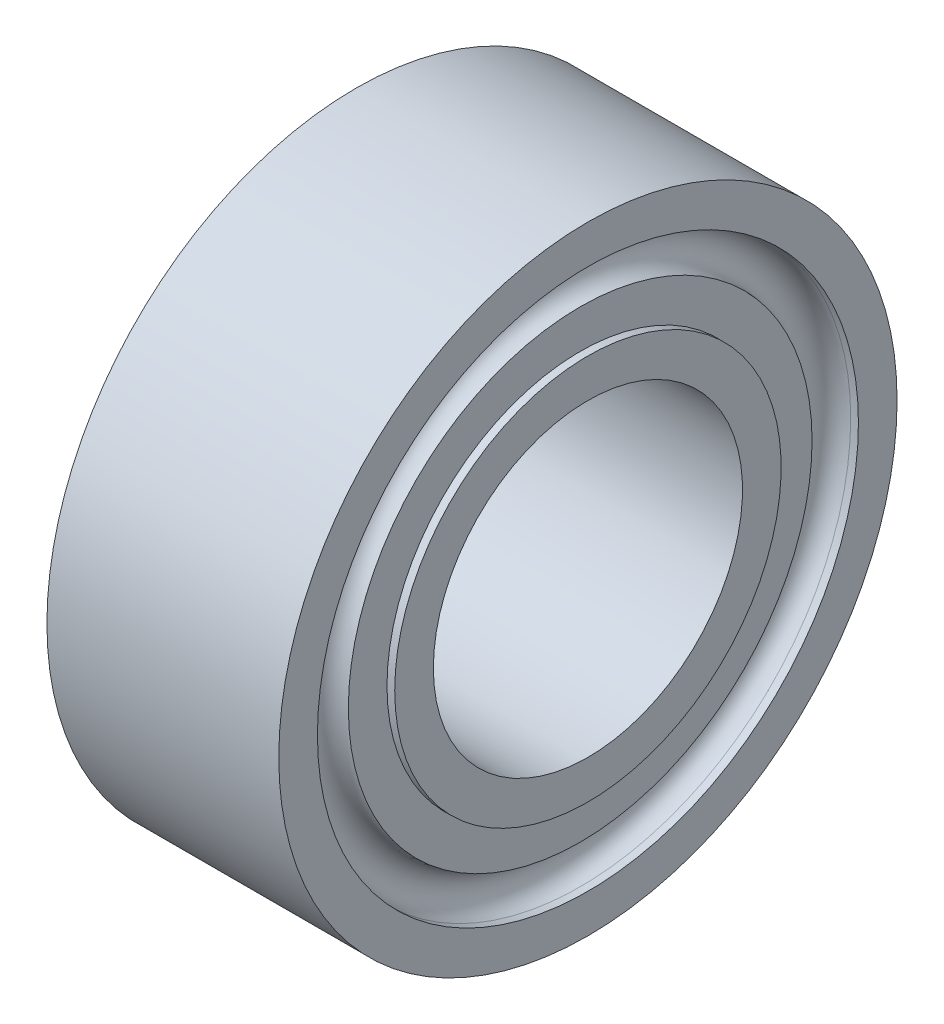
ISO-10303-21;
HEADER;
FILE_DESCRIPTION(('STEP AP214'),'2;1');
FILE_NAME('part.step','',(''),(''),'','','');
FILE_SCHEMA(('AUTOMOTIVE_DESIGN { 1 0 10303 214 1 1 1 1 }'));
ENDSEC;
DATA;
#1=APPLICATION_CONTEXT('core data for automotive mechanical design processes');
#2=APPLICATION_PROTOCOL_DEFINITION('international standard','automotive_design',2000,#1);
#3=PRODUCT_CONTEXT('',#1,'mechanical');
#4=PRODUCT('Part','Part','',(#3));
#5=PRODUCT_RELATED_PRODUCT_CATEGORY('part','',(#4));
#6=PRODUCT_DEFINITION_FORMATION('','',#4);
#7=PRODUCT_DEFINITION_CONTEXT('part definition',#1,'design');
#8=PRODUCT_DEFINITION('design','',#6,#7);
#9=PRODUCT_DEFINITION_SHAPE('','',#8);
#10=(LENGTH_UNIT() NAMED_UNIT(*) SI_UNIT(.MILLI.,.METRE.));
#11=(NAMED_UNIT(*) PLANE_ANGLE_UNIT() SI_UNIT($,.RADIAN.));
#12=(NAMED_UNIT(*) SI_UNIT($,.STERADIAN.) SOLID_ANGLE_UNIT());
#13=UNCERTAINTY_MEASURE_WITH_UNIT(LENGTH_MEASURE(1.E-05),#10,'distance_accuracy_value','');
#14=(GEOMETRIC_REPRESENTATION_CONTEXT(3) GLOBAL_UNCERTAINTY_ASSIGNED_CONTEXT((#13)) GLOBAL_UNIT_ASSIGNED_CONTEXT((#10,
#11,#12)) REPRESENTATION_CONTEXT('',''));
#15=CARTESIAN_POINT('',(0.,0.,0.));
#16=DIRECTION('',(0.,0.,1.));
#17=DIRECTION('',(1.,0.,0.));
#18=AXIS2_PLACEMENT_3D('',#15,#16,#17);
#19=CARTESIAN_POINT('',(0.,0.,0.));
#20=DIRECTION('',(-1.,0.,0.));
#21=DIRECTION('',(0.,0.,1.));
#22=AXIS2_PLACEMENT_3D('',#19,#20,#21);
#23=CYLINDRICAL_SURFACE('',#22,3.5);
#24=CARTESIAN_POINT('',(0.,0.,0.));
#25=DIRECTION('',(-1.,0.,0.));
#26=DIRECTION('',(0.,0.,1.));
#27=AXIS2_PLACEMENT_3D('',#24,#25,#26);
#28=CIRCLE('',#27,3.5);
#29=CARTESIAN_POINT('',(0.,0.,3.5));
#30=VERTEX_POINT('',#29);
#31=EDGE_CURVE('E100',#30,#30,#28,.T.);
#32=ORIENTED_EDGE('',*,*,#31,.T.);
#33=EDGE_LOOP('',(#32));
#34=FACE_BOUND('',#33,.T.);
#35=CARTESIAN_POINT('',(0.0999999999999998,0.,0.));
#36=DIRECTION('',(-1.,0.,0.));
#37=DIRECTION('',(0.,0.,1.));
#38=AXIS2_PLACEMENT_3D('',#35,#36,#37);
#39=CIRCLE('',#38,3.5);
#40=CARTESIAN_POINT('',(0.0999999999999998,0.,3.5));
#41=VERTEX_POINT('',#40);
#42=EDGE_CURVE('E10',#41,#41,#39,.T.);
#43=ORIENTED_EDGE('',*,*,#42,.F.);
#44=EDGE_LOOP('',(#43));
#45=FACE_BOUND('',#44,.T.);
#46=ADVANCED_FACE('F41',(#34,#45),#23,.F.);
#47=CARTESIAN_POINT('',(0.0999999999999998,0.,0.));
#48=DIRECTION('',(-1.,0.,0.));
#49=DIRECTION('',(0.,0.,1.));
#50=AXIS2_PLACEMENT_3D('',#47,#48,#49);
#51=TOROIDAL_SURFACE('',#50,3.25,0.25);
#52=CARTESIAN_POINT('',(0.0999999999999998,0.,0.));
#53=DIRECTION('',(-1.,0.,0.));
#54=DIRECTION('',(0.,0.,1.));
#55=AXIS2_PLACEMENT_3D('',#52,#53,#54);
#56=CIRCLE('',#55,3.);
#57=CARTESIAN_POINT('',(0.0999999999999998,0.,3.));
#58=VERTEX_POINT('',#57);
#59=EDGE_CURVE('E48',#58,#58,#56,.T.);
#60=ORIENTED_EDGE('',*,*,#59,.F.);
#61=EDGE_LOOP('',(#60));
#62=FACE_BOUND('',#61,.T.);
#63=ORIENTED_EDGE('',*,*,#42,.T.);
#64=EDGE_LOOP('',(#63));
#65=FACE_BOUND('',#64,.T.);
#66=ADVANCED_FACE('F119',(#62,#65),#51,.F.);
#67=CARTESIAN_POINT('',(0.0999999999999998,0.,0.));
#68=DIRECTION('',(-1.,0.,0.));
#69=DIRECTION('',(0.,0.,1.));
#70=AXIS2_PLACEMENT_3D('',#67,#68,#69);
#71=PLANE('',#70);
#72=ORIENTED_EDGE('',*,*,#59,.T.);
#73=EDGE_LOOP('',(#72));
#74=FACE_BOUND('',#73,.T.);
#75=CARTESIAN_POINT('',(0.0999999999999998,0.,0.));
#76=DIRECTION('',(-1.,0.,0.));
#77=DIRECTION('',(0.,0.,1.));
#78=AXIS2_PLACEMENT_3D('',#75,#76,#77);
#79=CIRCLE('',#78,2.5);
#80=CARTESIAN_POINT('',(0.0999999999999998,0.,2.5));
#81=VERTEX_POINT('',#80);
#82=EDGE_CURVE('E53',#81,#81,#79,.T.);
#83=ORIENTED_EDGE('',*,*,#82,.F.);
#84=EDGE_LOOP('',(#83));
#85=FACE_BOUND('',#84,.T.);
#86=ADVANCED_FACE('F123',(#74,#85),#71,.T.);
#87=CARTESIAN_POINT('',(0.,0.,0.));
#88=DIRECTION('',(-1.,0.,0.));
#89=DIRECTION('',(0.,0.,1.));
#90=AXIS2_PLACEMENT_3D('',#87,#88,#89);
#91=CYLINDRICAL_SURFACE('',#90,2.5);
#92=ORIENTED_EDGE('',*,*,#82,.T.);
#93=EDGE_LOOP('',(#92));
#94=FACE_BOUND('',#93,.T.);
#95=CARTESIAN_POINT('',(0.,0.,0.));
#96=DIRECTION('',(-1.,0.,0.));
#97=DIRECTION('',(0.,0.,1.));
#98=AXIS2_PLACEMENT_3D('',#95,#96,#97);
#99=CIRCLE('',#98,2.5);
#100=CARTESIAN_POINT('',(0.,0.,2.5));
#101=VERTEX_POINT('',#100);
#102=EDGE_CURVE('E58',#101,#101,#99,.T.);
#103=ORIENTED_EDGE('',*,*,#102,.F.);
#104=EDGE_LOOP('',(#103));
#105=FACE_BOUND('',#104,.T.);
#106=ADVANCED_FACE('F128',(#94,#105),#91,.T.);
#107=CARTESIAN_POINT('',(0.,0.,0.));
#108=DIRECTION('',(-1.,0.,0.));
#109=DIRECTION('',(0.,0.,1.));
#110=AXIS2_PLACEMENT_3D('',#107,#108,#109);
#111=PLANE('',#110);
#112=ORIENTED_EDGE('',*,*,#102,.T.);
#113=EDGE_LOOP('',(#112));
#114=FACE_BOUND('',#113,.T.);
#115=CARTESIAN_POINT('',(0.,0.,0.));
#116=DIRECTION('',(-1.,0.,0.));
#117=DIRECTION('',(0.,0.,1.));
#118=AXIS2_PLACEMENT_3D('',#115,#116,#117);
#119=CIRCLE('',#118,2.);
#120=CARTESIAN_POINT('',(0.,0.,2.));
#121=VERTEX_POINT('',#120);
#122=EDGE_CURVE('E64',#121,#121,#119,.T.);
#123=ORIENTED_EDGE('',*,*,#122,.F.);
#124=EDGE_LOOP('',(#123));
#125=FACE_BOUND('',#124,.T.);
#126=ADVANCED_FACE('F133',(#114,#125),#111,.T.);
#127=CARTESIAN_POINT('',(0.,0.,0.));
#128=DIRECTION('',(-1.,0.,0.));
#129=DIRECTION('',(0.,0.,1.));
#130=AXIS2_PLACEMENT_3D('',#127,#128,#129);
#131=CYLINDRICAL_SURFACE('',#130,2.);
#132=CARTESIAN_POINT('',(3.,0.,0.));
#133=DIRECTION('',(-1.,0.,0.));
#134=DIRECTION('',(0.,0.,1.));
#135=AXIS2_PLACEMENT_3D('',#132,#133,#134);
#136=CIRCLE('',#135,2.);
#137=CARTESIAN_POINT('',(3.,0.,2.));
#138=VERTEX_POINT('',#137);
#139=EDGE_CURVE('E68',#138,#138,#136,.T.);
#140=ORIENTED_EDGE('',*,*,#139,.F.);
#141=EDGE_LOOP('',(#140));
#142=FACE_BOUND('',#141,.T.);
#143=ORIENTED_EDGE('',*,*,#122,.T.);
#144=EDGE_LOOP('',(#143));
#145=FACE_BOUND('',#144,.T.);
#146=ADVANCED_FACE('F137',(#142,#145),#131,.F.);
#147=CARTESIAN_POINT('',(3.,0.,0.));
#148=DIRECTION('',(-1.,0.,0.));
#149=DIRECTION('',(0.,0.,1.));
#150=AXIS2_PLACEMENT_3D('',#147,#148,#149);
#151=PLANE('',#150);
#152=CARTESIAN_POINT('',(3.,0.,0.));
#153=DIRECTION('',(-1.,0.,0.));
#154=DIRECTION('',(0.,0.,1.));
#155=AXIS2_PLACEMENT_3D('',#152,#153,#154);
#156=CIRCLE('',#155,2.5);
#157=CARTESIAN_POINT('',(3.,0.,2.5));
#158=VERTEX_POINT('',#157);
#159=EDGE_CURVE('E72',#158,#158,#156,.T.);
#160=ORIENTED_EDGE('',*,*,#159,.F.);
#161=EDGE_LOOP('',(#160));
#162=FACE_BOUND('',#161,.T.);
#163=ORIENTED_EDGE('',*,*,#139,.T.);
#164=EDGE_LOOP('',(#163));
#165=FACE_BOUND('',#164,.T.);
#166=ADVANCED_FACE('F141',(#162,#165),#151,.F.);
#167=CARTESIAN_POINT('',(0.,0.,0.));
#168=DIRECTION('',(-1.,0.,0.));
#169=DIRECTION('',(0.,0.,1.));
#170=AXIS2_PLACEMENT_3D('',#167,#168,#169);
#171=CYLINDRICAL_SURFACE('',#170,2.5);
#172=CARTESIAN_POINT('',(2.9,0.,0.));
#173=DIRECTION('',(-1.,0.,0.));
#174=DIRECTION('',(0.,0.,1.));
#175=AXIS2_PLACEMENT_3D('',#172,#173,#174);
#176=CIRCLE('',#175,2.5);
#177=CARTESIAN_POINT('',(2.9,0.,2.5));
#178=VERTEX_POINT('',#177);
#179=EDGE_CURVE('E76',#178,#178,#176,.T.);
#180=ORIENTED_EDGE('',*,*,#179,.F.);
#181=EDGE_LOOP('',(#180));
#182=FACE_BOUND('',#181,.T.);
#183=ORIENTED_EDGE('',*,*,#159,.T.);
#184=EDGE_LOOP('',(#183));
#185=FACE_BOUND('',#184,.T.);
#186=ADVANCED_FACE('F145',(#182,#185),#171,.T.);
#187=CARTESIAN_POINT('',(2.9,0.,0.));
#188=DIRECTION('',(-1.,0.,0.));
#189=DIRECTION('',(0.,0.,1.));
#190=AXIS2_PLACEMENT_3D('',#187,#188,#189);
#191=PLANE('',#190);
#192=CARTESIAN_POINT('',(2.9,0.,0.));
#193=DIRECTION('',(-1.,0.,0.));
#194=DIRECTION('',(0.,0.,1.));
#195=AXIS2_PLACEMENT_3D('',#192,#193,#194);
#196=CIRCLE('',#195,3.);
#197=CARTESIAN_POINT('',(2.9,0.,3.));
#198=VERTEX_POINT('',#197);
#199=EDGE_CURVE('E80',#198,#198,#196,.T.);
#200=ORIENTED_EDGE('',*,*,#199,.F.);
#201=EDGE_LOOP('',(#200));
#202=FACE_BOUND('',#201,.T.);
#203=ORIENTED_EDGE('',*,*,#179,.T.);
#204=EDGE_LOOP('',(#203));
#205=FACE_BOUND('',#204,.T.);
#206=ADVANCED_FACE('F149',(#202,#205),#191,.F.);
#207=CARTESIAN_POINT('',(2.9,0.,0.));
#208=DIRECTION('',(-1.,0.,0.));
#209=DIRECTION('',(0.,0.,1.));
#210=AXIS2_PLACEMENT_3D('',#207,#208,#209);
#211=TOROIDAL_SURFACE('',#210,3.25,0.25);
#212=ORIENTED_EDGE('',*,*,#199,.T.);
#213=EDGE_LOOP('',(#212));
#214=FACE_BOUND('',#213,.T.);
#215=CARTESIAN_POINT('',(2.9,0.,0.));
#216=DIRECTION('',(-1.,0.,0.));
#217=DIRECTION('',(0.,0.,1.));
#218=AXIS2_PLACEMENT_3D('',#215,#216,#217);
#219=CIRCLE('',#218,3.5);
#220=CARTESIAN_POINT('',(2.9,0.,3.5));
#221=VERTEX_POINT('',#220);
#222=EDGE_CURVE('E84',#221,#221,#219,.T.);
#223=ORIENTED_EDGE('',*,*,#222,.F.);
#224=EDGE_LOOP('',(#223));
#225=FACE_BOUND('',#224,.T.);
#226=ADVANCED_FACE('F153',(#214,#225),#211,.F.);
#227=CARTESIAN_POINT('',(0.,0.,0.));
#228=DIRECTION('',(-1.,0.,0.));
#229=DIRECTION('',(0.,0.,1.));
#230=AXIS2_PLACEMENT_3D('',#227,#228,#229);
#231=CYLINDRICAL_SURFACE('',#230,3.5);
#232=CARTESIAN_POINT('',(3.,0.,0.));
#233=DIRECTION('',(-1.,0.,0.));
#234=DIRECTION('',(0.,0.,1.));
#235=AXIS2_PLACEMENT_3D('',#232,#233,#234);
#236=CIRCLE('',#235,3.5);
#237=CARTESIAN_POINT('',(3.,0.,3.5));
#238=VERTEX_POINT('',#237);
#239=EDGE_CURVE('E88',#238,#238,#236,.T.);
#240=ORIENTED_EDGE('',*,*,#239,.F.);
#241=EDGE_LOOP('',(#240));
#242=FACE_BOUND('',#241,.T.);
#243=ORIENTED_EDGE('',*,*,#222,.T.);
#244=EDGE_LOOP('',(#243));
#245=FACE_BOUND('',#244,.T.);
#246=ADVANCED_FACE('F157',(#242,#245),#231,.F.);
#247=CARTESIAN_POINT('',(3.,0.,0.));
#248=DIRECTION('',(-1.,0.,0.));
#249=DIRECTION('',(0.,0.,1.));
#250=AXIS2_PLACEMENT_3D('',#247,#248,#249);
#251=PLANE('',#250);
#252=CARTESIAN_POINT('',(3.,0.,0.));
#253=DIRECTION('',(-1.,0.,0.));
#254=DIRECTION('',(0.,0.,1.));
#255=AXIS2_PLACEMENT_3D('',#252,#253,#254);
#256=CIRCLE('',#255,4.);
#257=CARTESIAN_POINT('',(3.,0.,4.));
#258=VERTEX_POINT('',#257);
#259=EDGE_CURVE('E92',#258,#258,#256,.T.);
#260=ORIENTED_EDGE('',*,*,#259,.F.);
#261=EDGE_LOOP('',(#260));
#262=FACE_BOUND('',#261,.T.);
#263=ORIENTED_EDGE('',*,*,#239,.T.);
#264=EDGE_LOOP('',(#263));
#265=FACE_BOUND('',#264,.T.);
#266=ADVANCED_FACE('F115',(#262,#265),#251,.F.);
#267=CARTESIAN_POINT('',(0.,0.,0.));
#268=DIRECTION('',(-1.,0.,0.));
#269=DIRECTION('',(0.,0.,1.));
#270=AXIS2_PLACEMENT_3D('',#267,#268,#269);
#271=CYLINDRICAL_SURFACE('',#270,4.);
#272=CARTESIAN_POINT('',(0.,0.,0.));
#273=DIRECTION('',(-1.,0.,0.));
#274=DIRECTION('',(0.,0.,1.));
#275=AXIS2_PLACEMENT_3D('',#272,#273,#274);
#276=CIRCLE('',#275,4.);
#277=CARTESIAN_POINT('',(0.,0.,4.));
#278=VERTEX_POINT('',#277);
#279=EDGE_CURVE('E96',#278,#278,#276,.T.);
#280=ORIENTED_EDGE('',*,*,#279,.F.);
#281=EDGE_LOOP('',(#280));
#282=FACE_BOUND('',#281,.T.);
#283=ORIENTED_EDGE('',*,*,#259,.T.);
#284=EDGE_LOOP('',(#283));
#285=FACE_BOUND('',#284,.T.);
#286=ADVANCED_FACE('F109',(#282,#285),#271,.T.);
#287=CARTESIAN_POINT('',(0.,0.,0.));
#288=DIRECTION('',(-1.,0.,0.));
#289=DIRECTION('',(0.,0.,1.));
#290=AXIS2_PLACEMENT_3D('',#287,#288,#289);
#291=PLANE('',#290);
#292=ORIENTED_EDGE('',*,*,#279,.T.);
#293=EDGE_LOOP('',(#292));
#294=FACE_BOUND('',#293,.T.);
#295=ORIENTED_EDGE('',*,*,#31,.F.);
#296=EDGE_LOOP('',(#295));
#297=FACE_BOUND('',#296,.T.);
#298=ADVANCED_FACE('F107',(#294,#297),#291,.T.);
#299=CLOSED_SHELL('',(#46,#66,#86,#106,#126,#146,#166,#186,#206,#226,#246,#266,#286,#298));
#300=MANIFOLD_SOLID_BREP('B2',#299);
#301=ADVANCED_BREP_SHAPE_REPRESENTATION('',(#18,#300),#14);
#302=SHAPE_DEFINITION_REPRESENTATION(#9,#301);
ENDSEC;
END-ISO-10303-21;
